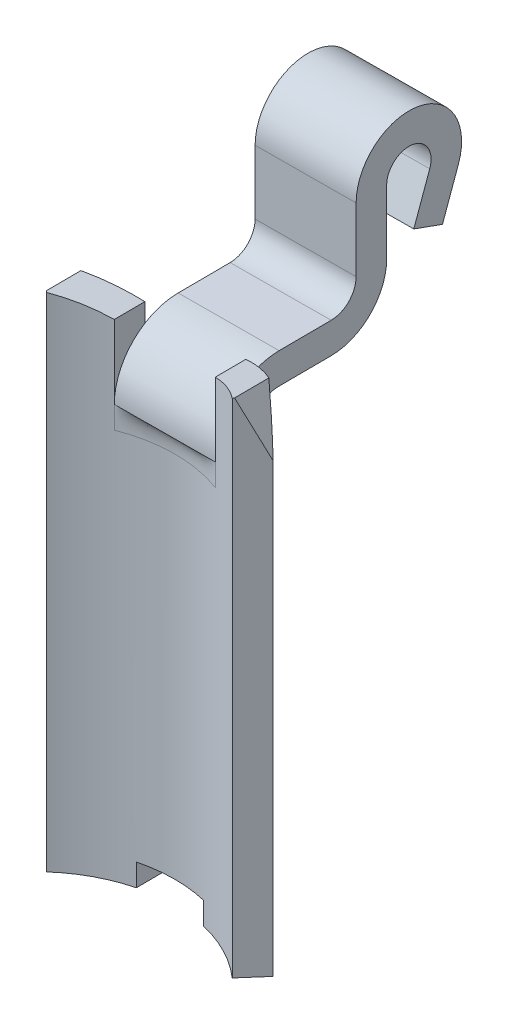
ISO-10303-21;
HEADER;
FILE_DESCRIPTION(('STEP AP214'),'2;1');
FILE_NAME('part.step','',(''),(''),'','','');
FILE_SCHEMA(('AUTOMOTIVE_DESIGN { 1 0 10303 214 1 1 1 1 }'));
ENDSEC;
DATA;
#1=APPLICATION_CONTEXT('core data for automotive mechanical design processes');
#2=APPLICATION_PROTOCOL_DEFINITION('international standard','automotive_design',2000,#1);
#3=PRODUCT_CONTEXT('',#1,'mechanical');
#4=PRODUCT('Part','Part','',(#3));
#5=PRODUCT_RELATED_PRODUCT_CATEGORY('part','',(#4));
#6=PRODUCT_DEFINITION_FORMATION('','',#4);
#7=PRODUCT_DEFINITION_CONTEXT('part definition',#1,'design');
#8=PRODUCT_DEFINITION('design','',#6,#7);
#9=PRODUCT_DEFINITION_SHAPE('','',#8);
#10=(LENGTH_UNIT() NAMED_UNIT(*) SI_UNIT(.MILLI.,.METRE.));
#11=(NAMED_UNIT(*) PLANE_ANGLE_UNIT() SI_UNIT($,.RADIAN.));
#12=(NAMED_UNIT(*) SI_UNIT($,.STERADIAN.) SOLID_ANGLE_UNIT());
#13=UNCERTAINTY_MEASURE_WITH_UNIT(LENGTH_MEASURE(1.E-05),#10,'distance_accuracy_value','');
#14=(GEOMETRIC_REPRESENTATION_CONTEXT(3) GLOBAL_UNCERTAINTY_ASSIGNED_CONTEXT((#13)) GLOBAL_UNIT_ASSIGNED_CONTEXT((#10,
#11,#12)) REPRESENTATION_CONTEXT('',''));
#15=CARTESIAN_POINT('',(0.,0.,0.));
#16=DIRECTION('',(0.,0.,1.));
#17=DIRECTION('',(1.,0.,0.));
#18=AXIS2_PLACEMENT_3D('',#15,#16,#17);
#19=CARTESIAN_POINT('',(-4.36036135623731,0.,0.));
#20=DIRECTION('',(0.,1.,0.));
#21=DIRECTION('',(0.,0.,1.));
#22=AXIS2_PLACEMENT_3D('',#19,#20,#21);
#23=PLANE('',#22);
#24=CARTESIAN_POINT('',(0.,0.,0.));
#25=DIRECTION('',(0.,1.,0.));
#26=DIRECTION('',(0.,0.,1.));
#27=AXIS2_PLACEMENT_3D('',#24,#25,#26);
#28=CIRCLE('',#27,1.9177);
#29=CARTESIAN_POINT('',(-0.391599735436339,0.,-1.87729138313853));
#30=VERTEX_POINT('',#29);
#31=CARTESIAN_POINT('',(-1.27808814790162,0.,-1.42970765410045));
#32=VERTEX_POINT('',#31);
#33=EDGE_CURVE('E409',#30,#32,#28,.T.);
#34=ORIENTED_EDGE('',*,*,#33,.F.);
#35=DIRECTION('',(0.0056429708265948,0.,0.999984078313375));
#36=VECTOR('',#35,1.);
#37=CARTESIAN_POINT('',(-0.381132781346214,0.,-0.0224550282823861));
#38=LINE('',#37,#36);
#39=CARTESIAN_POINT('',(-0.389690327236441,0.,-1.53892745081058));
#40=VERTEX_POINT('',#39);
#41=EDGE_CURVE('E105',#30,#40,#38,.T.);
#42=ORIENTED_EDGE('',*,*,#41,.T.);
#43=CARTESIAN_POINT('',(0.,0.,0.));
#44=DIRECTION('',(0.,1.,0.));
#45=DIRECTION('',(0.,0.,1.));
#46=AXIS2_PLACEMENT_3D('',#43,#44,#45);
#47=CIRCLE('',#46,1.5875);
#48=CARTESIAN_POINT('',(-1.05801998998478,0.,-1.18353282624209));
#49=VERTEX_POINT('',#48);
#50=EDGE_CURVE('E317',#40,#49,#47,.T.);
#51=ORIENTED_EDGE('',*,*,#50,.T.);
#52=DIRECTION('',(-0.666469285029785,0.,-0.745532488971398));
#53=VECTOR('',#52,1.);
#54=CARTESIAN_POINT('',(-1.93679101007827,0.,-2.16655239002732));
#55=LINE('',#54,#53);
#56=EDGE_CURVE('E321',#49,#32,#55,.T.);
#57=ORIENTED_EDGE('',*,*,#56,.T.);
#58=EDGE_LOOP('',(#34,#42,#51,#57));
#59=FACE_BOUND('',#58,.T.);
#60=ADVANCED_FACE('F97',(#59),#23,.F.);
#61=CARTESIAN_POINT('',(0.560628849584921,2.72972769820955,-1.92807599157847));
#62=DIRECTION('',(0.999984078313375,0.,-0.0056429708265948));
#63=DIRECTION('',(-0.0056429708265948,0.,-0.999984078313375));
#64=AXIS2_PLACEMENT_3D('',#61,#62,#63);
#65=PLANE('',#64);
#66=CARTESIAN_POINT('',(0.559011115045461,4.699,-2.21475278508123));
#67=DIRECTION('',(0.999984078313375,0.,-0.0056429708265948));
#68=DIRECTION('',(-0.0056429708265948,0.,-0.999984078313375));
#69=AXIS2_PLACEMENT_3D('',#66,#67,#68);
#70=CIRCLE('',#69,0.730501257776782);
#71=CARTESIAN_POINT('',(0.561161086930393,5.32227448817793,-1.83375885124383));
#72=VERTEX_POINT('',#71);
#73=CARTESIAN_POINT('',(0.563133312331886,4.699,-1.48426315811655));
#74=VERTEX_POINT('',#73);
#75=EDGE_CURVE('E570',#72,#74,#70,.T.);
#76=ORIENTED_EDGE('',*,*,#75,.T.);
#77=DIRECTION('',(0.,-1.,0.));
#78=VECTOR('',#77,1.);
#79=CARTESIAN_POINT('',(0.563133312331886,5.715,-1.48426315811655));
#80=LINE('',#79,#78);
#81=CARTESIAN_POINT('',(0.563133312331886,5.53586258856686,-1.48426315811655));
#82=VERTEX_POINT('',#81);
#83=EDGE_CURVE('E573',#74,#82,#80,.F.);
#84=ORIENTED_EDGE('',*,*,#83,.T.);
#85=DIRECTION('',(0.0056429708265948,0.,0.999984078313375));
#86=VECTOR('',#85,1.);
#87=CARTESIAN_POINT('',(0.560628849584921,5.53586258856686,-1.92807599157847));
#88=LINE('',#87,#86);
#89=CARTESIAN_POINT('',(0.561161086930393,5.53586258856686,-1.83375885124383));
#90=VERTEX_POINT('',#89);
#91=EDGE_CURVE('E684',#90,#82,#88,.T.);
#92=ORIENTED_EDGE('',*,*,#91,.F.);
#93=DIRECTION('',(0.,-1.,0.));
#94=VECTOR('',#93,1.);
#95=CARTESIAN_POINT('',(0.561161086930393,5.715,-1.83375885124383));
#96=LINE('',#95,#94);
#97=EDGE_CURVE('E120',#72,#90,#96,.F.);
#98=ORIENTED_EDGE('',*,*,#97,.F.);
#99=EDGE_LOOP('',(#76,#84,#92,#98));
#100=FACE_BOUND('',#99,.T.);
#101=ADVANCED_FACE('F476',(#100),#65,.F.);
#102=CARTESIAN_POINT('',(-0.582352951927267,2.72972769820955,-1.92162607592367));
#103=DIRECTION('',(-0.999984078313375,0.,0.0056429708265948));
#104=DIRECTION('',(0.0056429708265948,0.,0.999984078313375));
#105=AXIS2_PLACEMENT_3D('',#102,#103,#104);
#106=PLANE('',#105);
#107=CARTESIAN_POINT('',(-0.583970686466727,4.699,-2.20830286942643));
#108=DIRECTION('',(-0.999984078313375,0.,0.0056429708265948));
#109=DIRECTION('',(0.0056429708265948,0.,0.999984078313375));
#110=AXIS2_PLACEMENT_3D('',#107,#108,#109);
#111=CIRCLE('',#110,0.730501257776782);
#112=CARTESIAN_POINT('',(-0.581820714581795,5.32227448817793,-1.82730893558903));
#113=VERTEX_POINT('',#112);
#114=CARTESIAN_POINT('',(-0.579848489180302,4.699,-1.47781324246175));
#115=VERTEX_POINT('',#114);
#116=EDGE_CURVE('E301',#113,#115,#111,.F.);
#117=ORIENTED_EDGE('',*,*,#116,.F.);
#118=DIRECTION('',(0.,-1.,0.));
#119=VECTOR('',#118,1.);
#120=CARTESIAN_POINT('',(-0.581820714581795,5.715,-1.82730893558903));
#121=LINE('',#120,#119);
#122=CARTESIAN_POINT('',(-0.581820714581795,5.53586258856686,-1.82730893558903));
#123=VERTEX_POINT('',#122);
#124=EDGE_CURVE('E437',#123,#113,#121,.T.);
#125=ORIENTED_EDGE('',*,*,#124,.F.);
#126=DIRECTION('',(0.0056429708265948,0.,0.999984078313375));
#127=VECTOR('',#126,1.);
#128=CARTESIAN_POINT('',(-0.582352951927267,5.53586258856686,-1.92162607592367));
#129=LINE('',#128,#127);
#130=CARTESIAN_POINT('',(-0.579848489180302,5.53586258856686,-1.47781324246175));
#131=VERTEX_POINT('',#130);
#132=EDGE_CURVE('E681',#123,#131,#129,.T.);
#133=ORIENTED_EDGE('',*,*,#132,.T.);
#134=DIRECTION('',(0.,-1.,0.));
#135=VECTOR('',#134,1.);
#136=CARTESIAN_POINT('',(-0.579848489180302,5.715,-1.47781324246175));
#137=LINE('',#136,#135);
#138=EDGE_CURVE('E344',#131,#115,#137,.T.);
#139=ORIENTED_EDGE('',*,*,#138,.T.);
#140=EDGE_LOOP('',(#117,#125,#133,#139));
#141=FACE_BOUND('',#140,.T.);
#142=ADVANCED_FACE('F472',(#141),#106,.F.);
#143=CARTESIAN_POINT('',(-1.88795373570001,5.715,2.16050716346106));
#144=DIRECTION('',(-0.753006622516556,0.,-0.658012937901838));
#145=DIRECTION('',(-0.658012937901838,0.,0.753006622516556));
#146=AXIS2_PLACEMENT_3D('',#143,#144,#145);
#147=PLANE('',#146);
#148=DIRECTION('',(0.,-1.,0.));
#149=VECTOR('',#148,1.);
#150=CARTESIAN_POINT('',(1.26187141101436,5.715,-1.4440408));
#151=LINE('',#150,#149);
#152=CARTESIAN_POINT('',(1.26187141101436,5.08,-1.4440408));
#153=VERTEX_POINT('',#152);
#154=CARTESIAN_POINT('',(1.26187141101436,0.,-1.4440408));
#155=VERTEX_POINT('',#154);
#156=EDGE_CURVE('E330',#153,#155,#151,.T.);
#157=ORIENTED_EDGE('',*,*,#156,.F.);
#158=DIRECTION('',(-0.289835200165371,0.897767150159775,0.331677103278316));
#159=VECTOR('',#158,1.);
#160=CARTESIAN_POINT('',(0.485530909869357,7.48472171381836,-0.555624319080876));
#161=LINE('',#160,#159);
#162=CARTESIAN_POINT('',(1.05686797323847,5.715,-1.20944215095817));
#163=VERTEX_POINT('',#162);
#164=EDGE_CURVE('E677',#153,#163,#161,.T.);
#165=ORIENTED_EDGE('',*,*,#164,.T.);
#166=DIRECTION('',(-0.63969216091557,-0.234328718136982,0.732040976393704));
#167=VECTOR('',#166,1.);
#168=CARTESIAN_POINT('',(-1.72625372836969,4.69550127764011,1.97546342135934));
#169=LINE('',#168,#167);
#170=CARTESIAN_POINT('',(1.04459553891917,5.71050442544372,-1.19539801324503));
#171=VERTEX_POINT('',#170);
#172=EDGE_CURVE('E696',#163,#171,#169,.T.);
#173=ORIENTED_EDGE('',*,*,#172,.T.);
#174=DIRECTION('',(0.,-1.,0.));
#175=VECTOR('',#174,1.);
#176=CARTESIAN_POINT('',(1.04459553891917,5.715,-1.19539801324503));
#177=LINE('',#176,#175);
#178=CARTESIAN_POINT('',(1.04459553891917,0.,-1.19539801324503));
#179=VERTEX_POINT('',#178);
#180=EDGE_CURVE('E316',#171,#179,#177,.T.);
#181=ORIENTED_EDGE('',*,*,#180,.T.);
#182=DIRECTION('',(0.658012937901838,0.,-0.753006622516556));
#183=VECTOR('',#182,1.);
#184=CARTESIAN_POINT('',(-1.88795373570001,0.,2.16050716346106));
#185=LINE('',#184,#183);
#186=EDGE_CURVE('E315',#179,#155,#185,.T.);
#187=ORIENTED_EDGE('',*,*,#186,.T.);
#188=EDGE_LOOP('',(#157,#165,#173,#181,#187));
#189=FACE_BOUND('',#188,.T.);
#190=ADVANCED_FACE('F99',(#189),#147,.F.);
#191=CARTESIAN_POINT('',(0.,5.715,0.));
#192=DIRECTION('',(0.,-1.,0.));
#193=DIRECTION('',(0.,0.,-1.));
#194=AXIS2_PLACEMENT_3D('',#191,#192,#193);
#195=CYLINDRICAL_SURFACE('',#194,1.9177);
#196=CARTESIAN_POINT('',(0.,0.254,0.));
#197=DIRECTION('',(0.,1.,0.));
#198=DIRECTION('',(0.,0.,1.));
#199=AXIS2_PLACEMENT_3D('',#196,#197,#198);
#200=CIRCLE('',#199,1.9177);
#201=CARTESIAN_POINT('',(0.370388132238453,0.254,-1.8815913269084));
#202=VERTEX_POINT('',#201);
#203=CARTESIAN_POINT('',(-0.391599735436339,0.254,-1.87729138313853));
#204=VERTEX_POINT('',#203);
#205=EDGE_CURVE('E401',#202,#204,#200,.T.);
#206=ORIENTED_EDGE('',*,*,#205,.T.);
#207=DIRECTION('',(0.,-1.,0.));
#208=VECTOR('',#207,1.);
#209=CARTESIAN_POINT('',(-0.391599735436339,5.715,-1.87729138313853));
#210=LINE('',#209,#208);
#211=EDGE_CURVE('E772',#204,#30,#210,.T.);
#212=ORIENTED_EDGE('',*,*,#211,.T.);
#213=ORIENTED_EDGE('',*,*,#33,.T.);
#214=DIRECTION('',(0.,-1.,0.));
#215=VECTOR('',#214,1.);
#216=CARTESIAN_POINT('',(-1.27808814790162,5.715,-1.42970765410045));
#217=LINE('',#216,#215);
#218=CARTESIAN_POINT('',(-1.27808814790162,5.08,-1.42970765410045));
#219=VERTEX_POINT('',#218);
#220=EDGE_CURVE('E327',#219,#32,#217,.T.);
#221=ORIENTED_EDGE('',*,*,#220,.F.);
#222=CARTESIAN_POINT('',(0.,8.98865809221266,0.));
#223=DIRECTION('',(0.95104137387134,-0.309016994374942,-0.00536678417589645));
#224=DIRECTION('',(-0.309012074303196,-0.951056516295155,0.00174377388417981));
#225=AXIS2_PLACEMENT_3D('',#222,#223,#224);
#226=ELLIPSE('',#225,6.20580756045146,1.9177);
#227=CARTESIAN_POINT('',(-1.07266338357229,5.715,-1.58964353096638));
#228=VERTEX_POINT('',#227);
#229=EDGE_CURVE('E426',#219,#228,#226,.T.);
#230=ORIENTED_EDGE('',*,*,#229,.T.);
#231=CARTESIAN_POINT('',(0.,5.32785359968373,0.));
#232=DIRECTION('',(-0.342014697788126,-0.939692620785909,0.00193000969089451));
#233=DIRECTION('',(0.939677659294477,-0.342020143325667,-0.0053026580450613));
#234=AXIS2_PLACEMENT_3D('',#231,#232,#233);
#235=ELLIPSE('',#234,2.04077371427706,1.9177);
#236=EDGE_CURVE('E691',#228,#123,#235,.T.);
#237=ORIENTED_EDGE('',*,*,#236,.T.);
#238=ORIENTED_EDGE('',*,*,#124,.T.);
#239=CARTESIAN_POINT('',(-0.581820714581795,4.699,-1.82730893558903));
#240=VERTEX_POINT('',#239);
#241=EDGE_CURVE('E702',#113,#240,#121,.T.);
#242=ORIENTED_EDGE('',*,*,#241,.T.);
#243=CARTESIAN_POINT('',(-0.581820714581795,4.445,-1.82730893558903));
#244=VERTEX_POINT('',#243);
#245=EDGE_CURVE('E700',#240,#244,#121,.T.);
#246=ORIENTED_EDGE('',*,*,#245,.T.);
#247=CARTESIAN_POINT('',(0.561161086930393,4.445,-1.83375885124383));
#248=CARTESIAN_POINT('',(0.188377974472141,4.445,-1.94783676090708));
#249=CARTESIAN_POINT('',(-0.210348799411702,4.445,-1.94558672152985));
#250=CARTESIAN_POINT('',(-0.581820714581796,4.445,-1.82730893558903));
#251=B_SPLINE_CURVE_WITH_KNOTS('',3,(#247,#248,#249,#250),.UNSPECIFIED.,.F.,.F.,(4,4),(0.,1.),.UNSPECIFIED.);
#252=CARTESIAN_POINT('',(0.561161086930393,4.445,-1.83375885124383));
#253=VERTEX_POINT('',#252);
#254=EDGE_CURVE('E436',#244,#253,#251,.F.);
#255=ORIENTED_EDGE('',*,*,#254,.T.);
#256=CARTESIAN_POINT('',(0.561161086930393,4.699,-1.83375885124383));
#257=VERTEX_POINT('',#256);
#258=EDGE_CURVE('E432',#253,#257,#96,.F.);
#259=ORIENTED_EDGE('',*,*,#258,.T.);
#260=EDGE_CURVE('E435',#257,#72,#96,.F.);
#261=ORIENTED_EDGE('',*,*,#260,.T.);
#262=ORIENTED_EDGE('',*,*,#97,.T.);
#263=CARTESIAN_POINT('',(0.,5.32785359968373,0.));
#264=DIRECTION('',(0.342014697788125,-0.939692620785909,-0.00193000969089451));
#265=DIRECTION('',(-0.939677659294477,-0.342020143325667,0.0053026580450613));
#266=AXIS2_PLACEMENT_3D('',#263,#264,#265);
#267=ELLIPSE('',#266,2.04077371427706,1.9177);
#268=CARTESIAN_POINT('',(1.05465473118028,5.715,-1.60164811616006));
#269=VERTEX_POINT('',#268);
#270=EDGE_CURVE('E698',#90,#269,#267,.T.);
#271=ORIENTED_EDGE('',*,*,#270,.T.);
#272=CARTESIAN_POINT('',(0.,8.98865809221266,0.));
#273=DIRECTION('',(-0.95104137387134,-0.309016994374941,0.00536678417589645));
#274=DIRECTION('',(0.309012074303195,-0.951056516295156,-0.0017437738841798));
#275=AXIS2_PLACEMENT_3D('',#272,#273,#274);
#276=ELLIPSE('',#275,6.20580756045147,1.9177);
#277=EDGE_CURVE('E674',#269,#153,#276,.T.);
#278=ORIENTED_EDGE('',*,*,#277,.T.);
#279=ORIENTED_EDGE('',*,*,#156,.T.);
#280=CARTESIAN_POINT('',(0.370388132238452,0.,-1.8815913269084));
#281=VERTEX_POINT('',#280);
#282=EDGE_CURVE('E422',#155,#281,#28,.T.);
#283=ORIENTED_EDGE('',*,*,#282,.T.);
#284=DIRECTION('',(0.,-1.,0.));
#285=VECTOR('',#284,1.);
#286=CARTESIAN_POINT('',(0.370388132238454,5.715,-1.8815913269084));
#287=LINE('',#286,#285);
#288=EDGE_CURVE('E112',#281,#202,#287,.F.);
#289=ORIENTED_EDGE('',*,*,#288,.T.);
#290=EDGE_LOOP('',(#206,#212,#213,#221,#230,#237,#238,#242,#246,#255,#259,#261,#262,#271,#278,
#279,#283,#289));
#291=FACE_BOUND('',#290,.T.);
#292=ADVANCED_FACE('F460',(#291),#195,.T.);
#293=CARTESIAN_POINT('',(-1.93679101007827,5.715,-2.16655239002732));
#294=DIRECTION('',(-0.745532488971398,0.,0.666469285029785));
#295=DIRECTION('',(0.666469285029785,0.,0.745532488971398));
#296=AXIS2_PLACEMENT_3D('',#293,#294,#295);
#297=PLANE('',#296);
#298=DIRECTION('',(0.647913061533386,-0.234328718136982,0.724774941999731));
#299=VECTOR('',#298,1.);
#300=CARTESIAN_POINT('',(-1.88922027791062,6.01112206930444,-2.11333834528173));
#301=LINE('',#300,#299);
#302=CARTESIAN_POINT('',(-1.07045014151409,5.715,-1.19743756576437));
#303=VERTEX_POINT('',#302);
#304=CARTESIAN_POINT('',(-1.05801998998478,5.71050442544372,-1.18353282624209));
#305=VERTEX_POINT('',#304);
#306=EDGE_CURVE('E689',#303,#305,#301,.T.);
#307=ORIENTED_EDGE('',*,*,#306,.F.);
#308=DIRECTION('',(0.293559970487231,0.897767150159775,0.328384968933616));
#309=VECTOR('',#308,1.);
#310=CARTESIAN_POINT('',(-1.23853252362222,5.20096928618425,-1.38545954892255));
#311=LINE('',#310,#309);
#312=EDGE_CURVE('E429',#219,#303,#311,.T.);
#313=ORIENTED_EDGE('',*,*,#312,.F.);
#314=ORIENTED_EDGE('',*,*,#220,.T.);
#315=ORIENTED_EDGE('',*,*,#56,.F.);
#316=DIRECTION('',(0.,-1.,0.));
#317=VECTOR('',#316,1.);
#318=CARTESIAN_POINT('',(-1.05801998998478,5.715,-1.18353282624209));
#319=LINE('',#318,#317);
#320=EDGE_CURVE('E319',#305,#49,#319,.T.);
#321=ORIENTED_EDGE('',*,*,#320,.F.);
#322=EDGE_LOOP('',(#307,#313,#314,#315,#321));
#323=FACE_BOUND('',#322,.T.);
#324=ADVANCED_FACE('F371',(#323),#297,.T.);
#325=CARTESIAN_POINT('',(0.,5.715,0.));
#326=DIRECTION('',(0.,-1.,0.));
#327=DIRECTION('',(0.,0.,-1.));
#328=AXIS2_PLACEMENT_3D('',#325,#326,#327);
#329=CYLINDRICAL_SURFACE('',#328,1.5875);
#330=DIRECTION('',(0.,-1.,0.));
#331=VECTOR('',#330,1.);
#332=CARTESIAN_POINT('',(-0.389690327236441,5.715,-1.53892745081058));
#333=LINE('',#332,#331);
#334=CARTESIAN_POINT('',(-0.389690327236441,0.254,-1.53892745081058));
#335=VERTEX_POINT('',#334);
#336=EDGE_CURVE('E412',#335,#40,#333,.T.);
#337=ORIENTED_EDGE('',*,*,#336,.F.);
#338=CARTESIAN_POINT('',(0.,0.254,0.));
#339=DIRECTION('',(0.,1.,0.));
#340=DIRECTION('',(0.,0.,1.));
#341=AXIS2_PLACEMENT_3D('',#338,#339,#340);
#342=CIRCLE('',#341,1.5875);
#343=CARTESIAN_POINT('',(0.372297540438351,0.254,-1.54322739458045));
#344=VERTEX_POINT('',#343);
#345=EDGE_CURVE('E12',#344,#335,#342,.T.);
#346=ORIENTED_EDGE('',*,*,#345,.F.);
#347=DIRECTION('',(0.,-1.,0.));
#348=VECTOR('',#347,1.);
#349=CARTESIAN_POINT('',(0.372297540438352,5.715,-1.54322739458045));
#350=LINE('',#349,#348);
#351=CARTESIAN_POINT('',(0.372297540438351,0.,-1.54322739458045));
#352=VERTEX_POINT('',#351);
#353=EDGE_CURVE('E295',#352,#344,#350,.F.);
#354=ORIENTED_EDGE('',*,*,#353,.F.);
#355=EDGE_CURVE('E309',#179,#352,#47,.T.);
#356=ORIENTED_EDGE('',*,*,#355,.F.);
#357=ORIENTED_EDGE('',*,*,#180,.F.);
#358=CARTESIAN_POINT('',(0.,5.32785359968373,0.));
#359=DIRECTION('',(0.342014697788125,-0.939692620785909,-0.00193000969089451));
#360=DIRECTION('',(-0.939677659294477,-0.342020143325667,0.0053026580450613));
#361=AXIS2_PLACEMENT_3D('',#358,#359,#360);
#362=ELLIPSE('',#361,1.68938221380551,1.5875);
#363=EDGE_CURVE('E694',#82,#171,#362,.T.);
#364=ORIENTED_EDGE('',*,*,#363,.F.);
#365=ORIENTED_EDGE('',*,*,#83,.F.);
#366=CARTESIAN_POINT('',(0.563133312331886,4.445,-1.48426315811655));
#367=VERTEX_POINT('',#366);
#368=EDGE_CURVE('E350',#367,#74,#80,.F.);
#369=ORIENTED_EDGE('',*,*,#368,.F.);
#370=CARTESIAN_POINT('',(0.,4.445,0.));
#371=DIRECTION('',(0.,-1.,0.));
#372=DIRECTION('',(0.,0.,-1.));
#373=AXIS2_PLACEMENT_3D('',#370,#371,#372);
#374=CIRCLE('',#373,1.5875);
#375=CARTESIAN_POINT('',(0.363904641624312,4.445,-1.54523092651541));
#376=VERTEX_POINT('',#375);
#377=EDGE_CURVE('E388',#376,#367,#374,.T.);
#378=ORIENTED_EDGE('',*,*,#377,.F.);
#379=CARTESIAN_POINT('',(-0.00895820457661473,4.445,-1.58747278753677));
#380=VERTEX_POINT('',#379);
#381=EDGE_CURVE('E379',#380,#376,#374,.T.);
#382=ORIENTED_EDGE('',*,*,#381,.F.);
#383=CARTESIAN_POINT('',(-0.579848489180303,4.445,-1.47781324246175));
#384=CARTESIAN_POINT('',(-0.212884162331215,4.445,-1.6217987640369));
#385=CARTESIAN_POINT('',(0.194567369738339,4.445,-1.62409803775393));
#386=CARTESIAN_POINT('',(0.563133312331885,4.445,-1.48426315811655));
#387=B_SPLINE_CURVE_WITH_KNOTS('',3,(#383,#384,#385,#386),.UNSPECIFIED.,.F.,.F.,(4,4),(0.,1.),.UNSPECIFIED.);
#388=CARTESIAN_POINT('',(-0.579848489180302,4.445,-1.47781324246175));
#389=VERTEX_POINT('',#388);
#390=EDGE_CURVE('E347',#389,#380,#387,.T.);
#391=ORIENTED_EDGE('',*,*,#390,.F.);
#392=EDGE_CURVE('E335',#115,#389,#137,.T.);
#393=ORIENTED_EDGE('',*,*,#392,.F.);
#394=ORIENTED_EDGE('',*,*,#138,.F.);
#395=CARTESIAN_POINT('',(0.,5.32785359968373,0.));
#396=DIRECTION('',(-0.342014697788126,-0.939692620785909,0.00193000969089451));
#397=DIRECTION('',(0.939677659294477,-0.342020143325667,-0.0053026580450613));
#398=AXIS2_PLACEMENT_3D('',#395,#396,#397);
#399=ELLIPSE('',#398,1.68938221380551,1.5875);
#400=EDGE_CURVE('E417',#305,#131,#399,.T.);
#401=ORIENTED_EDGE('',*,*,#400,.F.);
#402=ORIENTED_EDGE('',*,*,#320,.T.);
#403=ORIENTED_EDGE('',*,*,#50,.F.);
#404=EDGE_LOOP('',(#337,#346,#354,#356,#357,#364,#365,#369,#378,#382,#391,#393,#394,#401,#402,#403));
#405=FACE_BOUND('',#404,.T.);
#406=ADVANCED_FACE('F307',(#405),#329,.F.);
#407=ORIENTED_EDGE('',*,*,#355,.T.);
#408=DIRECTION('',(-0.0056429708265948,0.,-0.999984078313375));
#409=VECTOR('',#408,1.);
#410=CARTESIAN_POINT('',(0.380855086328576,0.,-0.0267549720522514));
#411=LINE('',#410,#409);
#412=EDGE_CURVE('E292',#352,#281,#411,.T.);
#413=ORIENTED_EDGE('',*,*,#412,.T.);
#414=ORIENTED_EDGE('',*,*,#282,.F.);
#415=ORIENTED_EDGE('',*,*,#186,.F.);
#416=EDGE_LOOP('',(#407,#413,#414,#415));
#417=FACE_BOUND('',#416,.T.);
#418=ADVANCED_FACE('F313',(#417),#23,.F.);
#419=CARTESIAN_POINT('',(-1.85028804097525,3.32739686871312,-1.91447104128594));
#420=DIRECTION('',(0.95104137387134,-0.309016994374942,-0.00536678417589645));
#421=DIRECTION('',(0.30902144468235,0.951055070291113,0.));
#422=AXIS2_PLACEMENT_3D('',#419,#420,#421);
#423=PLANE('',#422);
#424=ORIENTED_EDGE('',*,*,#312,.T.);
#425=DIRECTION('',(-0.0056429708265948,0.,-0.999984078313375));
#426=VECTOR('',#425,1.);
#427=CARTESIAN_POINT('',(-1.0637979048851,5.715,-0.0186027075704793));
#428=LINE('',#427,#426);
#429=EDGE_CURVE('E332',#303,#228,#428,.T.);
#430=ORIENTED_EDGE('',*,*,#429,.T.);
#431=ORIENTED_EDGE('',*,*,#229,.F.);
#432=EDGE_LOOP('',(#424,#430,#431));
#433=FACE_BOUND('',#432,.T.);
#434=ADVANCED_FACE('F482',(#433),#423,.F.);
#435=CARTESIAN_POINT('',(-0.845886846502342,5.02392459024651,-1.92013893816702));
#436=DIRECTION('',(0.342014697788125,-0.939692620785909,-0.00193000969089451));
#437=DIRECTION('',(0.939694370938896,0.342015334781576,0.));
#438=AXIS2_PLACEMENT_3D('',#435,#436,#437);
#439=PLANE('',#438);
#440=ORIENTED_EDGE('',*,*,#91,.T.);
#441=ORIENTED_EDGE('',*,*,#363,.T.);
#442=ORIENTED_EDGE('',*,*,#172,.F.);
#443=DIRECTION('',(0.0056429708265948,0.,0.999984078313375));
#444=VECTOR('',#443,1.);
#445=CARTESIAN_POINT('',(1.05279700620511,5.715,-1.93085332634791));
#446=LINE('',#445,#444);
#447=EDGE_CURVE('E680',#269,#163,#446,.T.);
#448=ORIENTED_EDGE('',*,*,#447,.F.);
#449=ORIENTED_EDGE('',*,*,#270,.F.);
#450=EDGE_LOOP('',(#440,#441,#442,#448,#449));
#451=FACE_BOUND('',#450,.T.);
#452=ADVANCED_FACE('F486',(#451),#439,.F.);
#453=CARTESIAN_POINT('',(0.82412970146743,5.02393661699455,-1.9295629428732));
#454=DIRECTION('',(-0.342014697788126,-0.939692620785909,0.00193000969089451));
#455=DIRECTION('',(0.939694370938896,-0.342015334781576,0.));
#456=AXIS2_PLACEMENT_3D('',#453,#454,#455);
#457=PLANE('',#456);
#458=ORIENTED_EDGE('',*,*,#429,.F.);
#459=ORIENTED_EDGE('',*,*,#306,.T.);
#460=ORIENTED_EDGE('',*,*,#400,.T.);
#461=ORIENTED_EDGE('',*,*,#132,.F.);
#462=ORIENTED_EDGE('',*,*,#236,.F.);
#463=EDGE_LOOP('',(#458,#459,#460,#461,#462));
#464=FACE_BOUND('',#463,.T.);
#465=ADVANCED_FACE('F491',(#464),#457,.F.);
#466=CARTESIAN_POINT('',(1.82856036534076,3.32740786635064,-1.9352310060519));
#467=DIRECTION('',(-0.95104137387134,-0.309016994374941,0.00536678417589645));
#468=DIRECTION('',(0.30902144468235,-0.951055070291113,0.));
#469=AXIS2_PLACEMENT_3D('',#466,#467,#468);
#470=PLANE('',#469);
#471=ORIENTED_EDGE('',*,*,#277,.F.);
#472=ORIENTED_EDGE('',*,*,#447,.T.);
#473=ORIENTED_EDGE('',*,*,#164,.F.);
#474=EDGE_LOOP('',(#471,#472,#473));
#475=FACE_BOUND('',#474,.T.);
#476=ADVANCED_FACE('F500',(#475),#470,.F.);
#477=CARTESIAN_POINT('',(0.559011115045461,5.08,-2.21475278508123));
#478=DIRECTION('',(-0.999984078313375,0.,0.0056429708265948));
#479=DIRECTION('',(0.0056429708265948,0.,0.999984078313375));
#480=AXIS2_PLACEMENT_3D('',#477,#478,#479);
#481=PLANE('',#480);
#482=CARTESIAN_POINT('',(0.559011115045461,5.42950125777678,-2.21475278508123));
#483=VERTEX_POINT('',#482);
#484=EDGE_CURVE('E449',#483,#72,#70,.T.);
#485=ORIENTED_EDGE('',*,*,#484,.T.);
#486=ORIENTED_EDGE('',*,*,#260,.F.);
#487=CARTESIAN_POINT('',(0.559011115045461,4.699,-2.21475278508123));
#488=DIRECTION('',(0.999984078313375,0.,-0.0056429708265948));
#489=DIRECTION('',(-0.0056429708265948,0.,-0.999984078313375));
#490=AXIS2_PLACEMENT_3D('',#487,#488,#489);
#491=CIRCLE('',#490,0.381);
#492=CARTESIAN_POINT('',(0.559011115045461,5.08,-2.21475278508123));
#493=VERTEX_POINT('',#492);
#494=EDGE_CURVE('E445',#493,#257,#491,.T.);
#495=ORIENTED_EDGE('',*,*,#494,.F.);
#496=DIRECTION('',(-0.0056429708265948,0.,-0.999984078313375));
#497=VECTOR('',#496,1.);
#498=CARTESIAN_POINT('',(0.559011115045461,5.08,-2.21475278508123));
#499=LINE('',#498,#497);
#500=CARTESIAN_POINT('',(0.55565277453709,5.08,-2.80988027042955));
#501=VERTEX_POINT('',#500);
#502=EDGE_CURVE('E584',#493,#501,#499,.T.);
#503=ORIENTED_EDGE('',*,*,#502,.T.);
#504=CARTESIAN_POINT('',(0.55565277453709,5.715,-2.80988027042955));
#505=DIRECTION('',(0.999984078313375,0.,-0.0056429708265948));
#506=DIRECTION('',(-0.0056429708265948,0.,-0.999984078313375));
#507=AXIS2_PLACEMENT_3D('',#504,#505,#506);
#508=CIRCLE('',#507,0.635000000000002);
#509=CARTESIAN_POINT('',(0.552069488062202,5.715,-3.44487016015854));
#510=VERTEX_POINT('',#509);
#511=EDGE_CURVE('E602',#501,#510,#508,.T.);
#512=ORIENTED_EDGE('',*,*,#511,.T.);
#513=DIRECTION('',(0.,1.,0.));
#514=VECTOR('',#513,1.);
#515=CARTESIAN_POINT('',(0.552069488062202,5.715,-3.44487016015854));
#516=LINE('',#515,#514);
#517=CARTESIAN_POINT('',(0.552069488062202,6.4418649394985,-3.44487016015854));
#518=VERTEX_POINT('',#517);
#519=EDGE_CURVE('E620',#510,#518,#516,.T.);
#520=ORIENTED_EDGE('',*,*,#519,.T.);
#521=CARTESIAN_POINT('',(0.550636173472248,6.4418649394985,-3.69886611605014));
#522=DIRECTION('',(-0.999984078313375,0.,0.0056429708265948));
#523=DIRECTION('',(0.0056429708265948,0.,0.999984078313375));
#524=AXIS2_PLACEMENT_3D('',#521,#522,#523);
#525=CIRCLE('',#524,0.253999999999998);
#526=CARTESIAN_POINT('',(0.549289298328802,6.35499182309378,-3.93754424151093));
#527=VERTEX_POINT('',#526);
#528=EDGE_CURVE('E638',#518,#527,#525,.T.);
#529=ORIENTED_EDGE('',*,*,#528,.T.);
#530=DIRECTION('',(0.00193000969089449,-0.93969262078591,0.342014697788122));
#531=VECTOR('',#530,1.);
#532=CARTESIAN_POINT('',(0.549289298328802,6.35499182309378,-3.93754424151093));
#533=LINE('',#532,#531);
#534=CARTESIAN_POINT('',(0.55031872874463,5.85377767379214,-3.75512011471811));
#535=VERTEX_POINT('',#534);
#536=EDGE_CURVE('E662',#527,#535,#533,.T.);
#537=ORIENTED_EDGE('',*,*,#536,.T.);
#538=DIRECTION('',(0.00530265804506135,0.342020143325681,0.939677659294472));
#539=VECTOR('',#538,1.);
#540=CARTESIAN_POINT('',(0.55031872874463,5.85377767379214,-3.75512011471811));
#541=LINE('',#540,#539);
#542=CARTESIAN_POINT('',(0.54846544308832,5.73424120351481,-4.08353863854627));
#543=VERTEX_POINT('',#542);
#544=EDGE_CURVE('E653',#543,#535,#541,.T.);
#545=ORIENTED_EDGE('',*,*,#544,.F.);
#546=DIRECTION('',(0.00193000969089449,-0.93969262078591,0.342014697788122));
#547=VECTOR('',#546,1.);
#548=CARTESIAN_POINT('',(0.547436012672493,6.23545535281646,-4.26596276533909));
#549=LINE('',#548,#547);
#550=CARTESIAN_POINT('',(0.547436012672493,6.23545535281646,-4.26596276533909));
#551=VERTEX_POINT('',#550);
#552=EDGE_CURVE('E665',#551,#543,#549,.T.);
#553=ORIENTED_EDGE('',*,*,#552,.F.);
#554=CARTESIAN_POINT('',(0.550636173472247,6.4418649394985,-3.69886611605014));
#555=DIRECTION('',(-0.999984078313375,0.,0.0056429708265948));
#556=DIRECTION('',(0.0056429708265948,0.,0.999984078313375));
#557=AXIS2_PLACEMENT_3D('',#554,#555,#556);
#558=CIRCLE('',#557,0.60350125777678);
#559=CARTESIAN_POINT('',(0.554041713463695,6.4418649394985,-3.09537446703126));
#560=VERTEX_POINT('',#559);
#561=EDGE_CURVE('E641',#560,#551,#558,.T.);
#562=ORIENTED_EDGE('',*,*,#561,.F.);
#563=DIRECTION('',(0.,1.,0.));
#564=VECTOR('',#563,1.);
#565=CARTESIAN_POINT('',(0.554041713463695,5.715,-3.09537446703126));
#566=LINE('',#565,#564);
#567=CARTESIAN_POINT('',(0.554041713463695,5.715,-3.09537446703126));
#568=VERTEX_POINT('',#567);
#569=EDGE_CURVE('E623',#568,#560,#566,.T.);
#570=ORIENTED_EDGE('',*,*,#569,.F.);
#571=CARTESIAN_POINT('',(0.55565277453709,5.715,-2.80988027042955));
#572=DIRECTION('',(0.999984078313375,0.,-0.0056429708265948));
#573=DIRECTION('',(-0.0056429708265948,0.,-0.999984078313375));
#574=AXIS2_PLACEMENT_3D('',#571,#572,#573);
#575=CIRCLE('',#574,0.28549874222322);
#576=CARTESIAN_POINT('',(0.55565277453709,5.42950125777678,-2.80988027042955));
#577=VERTEX_POINT('',#576);
#578=EDGE_CURVE('E605',#577,#568,#575,.T.);
#579=ORIENTED_EDGE('',*,*,#578,.F.);
#580=DIRECTION('',(-0.0056429708265948,0.,-0.999984078313375));
#581=VECTOR('',#580,1.);
#582=CARTESIAN_POINT('',(0.559011115045461,5.42950125777678,-2.21475278508123));
#583=LINE('',#582,#581);
#584=EDGE_CURVE('E587',#483,#577,#583,.T.);
#585=ORIENTED_EDGE('',*,*,#584,.F.);
#586=EDGE_LOOP('',(#485,#486,#495,#503,#512,#520,#529,#537,#545,#553,#562,#570,#579,#585));
#587=FACE_BOUND('',#586,.T.);
#588=ADVANCED_FACE('F504',(#587),#481,.F.);
#589=CARTESIAN_POINT('',(-0.583970686466727,5.08,-2.20830286942643));
#590=DIRECTION('',(0.999984078313375,0.,-0.0056429708265948));
#591=DIRECTION('',(-0.0056429708265948,0.,-0.999984078313375));
#592=AXIS2_PLACEMENT_3D('',#589,#590,#591);
#593=PLANE('',#592);
#594=CARTESIAN_POINT('',(-0.583970686466728,4.699,-2.20830286942643));
#595=DIRECTION('',(0.999984078313375,0.,-0.0056429708265948));
#596=DIRECTION('',(-0.0056429708265948,0.,-0.999984078313375));
#597=AXIS2_PLACEMENT_3D('',#594,#595,#596);
#598=CIRCLE('',#597,0.381);
#599=CARTESIAN_POINT('',(-0.583970686466727,5.08,-2.20830286942643));
#600=VERTEX_POINT('',#599);
#601=EDGE_CURVE('E706',#600,#240,#598,.T.);
#602=ORIENTED_EDGE('',*,*,#601,.T.);
#603=ORIENTED_EDGE('',*,*,#241,.F.);
#604=CARTESIAN_POINT('',(-0.583970686466728,4.699,-2.20830286942643));
#605=DIRECTION('',(0.999984078313375,0.,-0.0056429708265948));
#606=DIRECTION('',(-0.0056429708265948,0.,-0.999984078313375));
#607=AXIS2_PLACEMENT_3D('',#604,#605,#606);
#608=CIRCLE('',#607,0.730501257776782);
#609=CARTESIAN_POINT('',(-0.583970686466727,5.42950125777678,-2.20830286942643));
#610=VERTEX_POINT('',#609);
#611=EDGE_CURVE('E572',#610,#113,#608,.T.);
#612=ORIENTED_EDGE('',*,*,#611,.F.);
#613=DIRECTION('',(-0.0056429708265948,0.,-0.999984078313375));
#614=VECTOR('',#613,1.);
#615=CARTESIAN_POINT('',(-0.583970686466727,5.42950125777678,-2.20830286942643));
#616=LINE('',#615,#614);
#617=CARTESIAN_POINT('',(-0.587329026975098,5.42950125777678,-2.80343035477475));
#618=VERTEX_POINT('',#617);
#619=EDGE_CURVE('E590',#610,#618,#616,.T.);
#620=ORIENTED_EDGE('',*,*,#619,.T.);
#621=CARTESIAN_POINT('',(-0.587329026975098,5.715,-2.80343035477475));
#622=DIRECTION('',(0.999984078313375,0.,-0.0056429708265948));
#623=DIRECTION('',(-0.0056429708265948,0.,-0.999984078313375));
#624=AXIS2_PLACEMENT_3D('',#621,#622,#623);
#625=CIRCLE('',#624,0.28549874222322);
#626=CARTESIAN_POINT('',(-0.588940088048493,5.715,-3.08892455137646));
#627=VERTEX_POINT('',#626);
#628=EDGE_CURVE('E608',#618,#627,#625,.T.);
#629=ORIENTED_EDGE('',*,*,#628,.T.);
#630=DIRECTION('',(0.,1.,0.));
#631=VECTOR('',#630,1.);
#632=CARTESIAN_POINT('',(-0.588940088048493,5.715,-3.08892455137646));
#633=LINE('',#632,#631);
#634=CARTESIAN_POINT('',(-0.588940088048493,6.4418649394985,-3.08892455137646));
#635=VERTEX_POINT('',#634);
#636=EDGE_CURVE('E626',#627,#635,#633,.T.);
#637=ORIENTED_EDGE('',*,*,#636,.T.);
#638=CARTESIAN_POINT('',(-0.592345628039941,6.4418649394985,-3.69241620039534));
#639=DIRECTION('',(-0.999984078313375,0.,0.0056429708265948));
#640=DIRECTION('',(0.0056429708265948,0.,0.999984078313375));
#641=AXIS2_PLACEMENT_3D('',#638,#639,#640);
#642=CIRCLE('',#641,0.603501257776781);
#643=CARTESIAN_POINT('',(-0.595545788839696,6.23545535281646,-4.2595128496843));
#644=VERTEX_POINT('',#643);
#645=EDGE_CURVE('E644',#635,#644,#642,.T.);
#646=ORIENTED_EDGE('',*,*,#645,.T.);
#647=DIRECTION('',(0.00193000969089449,-0.93969262078591,0.342014697788122));
#648=VECTOR('',#647,1.);
#649=CARTESIAN_POINT('',(-0.595545788839696,6.23545535281646,-4.2595128496843));
#650=LINE('',#649,#648);
#651=CARTESIAN_POINT('',(-0.594516358423868,5.73424120351482,-4.07708872289147));
#652=VERTEX_POINT('',#651);
#653=EDGE_CURVE('E668',#644,#652,#650,.T.);
#654=ORIENTED_EDGE('',*,*,#653,.T.);
#655=DIRECTION('',(-0.00530265804506135,-0.342020143325681,-0.939677659294472));
#656=VECTOR('',#655,1.);
#657=CARTESIAN_POINT('',(-0.592663072767559,5.85377767379213,-3.74867019906331));
#658=LINE('',#657,#656);
#659=CARTESIAN_POINT('',(-0.592663072767559,5.85377767379213,-3.74867019906331));
#660=VERTEX_POINT('',#659);
#661=EDGE_CURVE('E659',#660,#652,#658,.T.);
#662=ORIENTED_EDGE('',*,*,#661,.F.);
#663=DIRECTION('',(0.00193000969089449,-0.93969262078591,0.342014697788122));
#664=VECTOR('',#663,1.);
#665=CARTESIAN_POINT('',(-0.593692503183387,6.35499182309378,-3.93109432585614));
#666=LINE('',#665,#664);
#667=CARTESIAN_POINT('',(-0.593692503183387,6.35499182309378,-3.93109432585614));
#668=VERTEX_POINT('',#667);
#669=EDGE_CURVE('E671',#668,#660,#666,.T.);
#670=ORIENTED_EDGE('',*,*,#669,.F.);
#671=CARTESIAN_POINT('',(-0.592345628039941,6.4418649394985,-3.69241620039534));
#672=DIRECTION('',(-0.999984078313375,0.,0.0056429708265948));
#673=DIRECTION('',(0.0056429708265948,0.,0.999984078313375));
#674=AXIS2_PLACEMENT_3D('',#671,#672,#673);
#675=CIRCLE('',#674,0.254);
#676=CARTESIAN_POINT('',(-0.590912313449986,6.4418649394985,-3.43842024450374));
#677=VERTEX_POINT('',#676);
#678=EDGE_CURVE('E647',#677,#668,#675,.T.);
#679=ORIENTED_EDGE('',*,*,#678,.F.);
#680=DIRECTION('',(0.,1.,0.));
#681=VECTOR('',#680,1.);
#682=CARTESIAN_POINT('',(-0.590912313449986,5.715,-3.43842024450374));
#683=LINE('',#682,#681);
#684=CARTESIAN_POINT('',(-0.590912313449986,5.715,-3.43842024450374));
#685=VERTEX_POINT('',#684);
#686=EDGE_CURVE('E629',#685,#677,#683,.T.);
#687=ORIENTED_EDGE('',*,*,#686,.F.);
#688=CARTESIAN_POINT('',(-0.587329026975098,5.715,-2.80343035477475));
#689=DIRECTION('',(0.999984078313375,0.,-0.0056429708265948));
#690=DIRECTION('',(-0.0056429708265948,0.,-0.999984078313375));
#691=AXIS2_PLACEMENT_3D('',#688,#689,#690);
#692=CIRCLE('',#691,0.635000000000002);
#693=CARTESIAN_POINT('',(-0.587329026975098,5.08,-2.80343035477475));
#694=VERTEX_POINT('',#693);
#695=EDGE_CURVE('E611',#694,#685,#692,.T.);
#696=ORIENTED_EDGE('',*,*,#695,.F.);
#697=DIRECTION('',(-0.0056429708265948,0.,-0.999984078313375));
#698=VECTOR('',#697,1.);
#699=CARTESIAN_POINT('',(-0.583970686466727,5.08,-2.20830286942643));
#700=LINE('',#699,#698);
#701=EDGE_CURVE('E593',#600,#694,#700,.T.);
#702=ORIENTED_EDGE('',*,*,#701,.F.);
#703=EDGE_LOOP('',(#602,#603,#612,#620,#629,#637,#646,#654,#662,#670,#679,#687,#696,#702));
#704=FACE_BOUND('',#703,.T.);
#705=ADVANCED_FACE('F510',(#704),#593,.F.);
#706=CARTESIAN_POINT('',(0.547436012672493,6.23545535281646,-4.26596276533909));
#707=DIRECTION('',(-0.00530265804506115,-0.342020143325664,-0.939677659294478));
#708=DIRECTION('',(0.,0.939690870586971,-0.342024951919448));
#709=AXIS2_PLACEMENT_3D('',#706,#707,#708);
#710=PLANE('',#709);
#711=DIRECTION('',(0.999984078313376,0.,-0.00564297082659466));
#712=VECTOR('',#711,1.);
#713=CARTESIAN_POINT('',(0.547436012672493,6.23545535281646,-4.26596276533909));
#714=LINE('',#713,#712);
#715=EDGE_CURVE('E635',#644,#551,#714,.T.);
#716=ORIENTED_EDGE('',*,*,#715,.T.);
#717=ORIENTED_EDGE('',*,*,#552,.T.);
#718=DIRECTION('',(0.999984078313376,0.,-0.00564297082659466));
#719=VECTOR('',#718,1.);
#720=CARTESIAN_POINT('',(0.54846544308832,5.73424120351481,-4.08353863854627));
#721=LINE('',#720,#719);
#722=EDGE_CURVE('E656',#652,#543,#721,.T.);
#723=ORIENTED_EDGE('',*,*,#722,.F.);
#724=ORIENTED_EDGE('',*,*,#653,.F.);
#725=EDGE_LOOP('',(#716,#717,#723,#724));
#726=FACE_BOUND('',#725,.T.);
#727=ADVANCED_FACE('F506',(#726),#710,.T.);
#728=CARTESIAN_POINT('',(0.549289298328802,6.35499182309378,-3.93754424151093));
#729=DIRECTION('',(0.00530265804506115,0.342020143325664,0.939677659294478));
#730=DIRECTION('',(0.,-0.939690870586971,0.342024951919448));
#731=AXIS2_PLACEMENT_3D('',#728,#729,#730);
#732=PLANE('',#731);
#733=DIRECTION('',(-0.999984078313376,0.,0.00564297082659466));
#734=VECTOR('',#733,1.);
#735=CARTESIAN_POINT('',(0.549289298328802,6.35499182309378,-3.93754424151093));
#736=LINE('',#735,#734);
#737=EDGE_CURVE('E632',#527,#668,#736,.T.);
#738=ORIENTED_EDGE('',*,*,#737,.T.);
#739=ORIENTED_EDGE('',*,*,#669,.T.);
#740=DIRECTION('',(-0.999984078313376,0.,0.00564297082659466));
#741=VECTOR('',#740,1.);
#742=CARTESIAN_POINT('',(0.55031872874463,5.85377767379214,-3.75512011471811));
#743=LINE('',#742,#741);
#744=EDGE_CURVE('E650',#535,#660,#743,.T.);
#745=ORIENTED_EDGE('',*,*,#744,.F.);
#746=ORIENTED_EDGE('',*,*,#536,.F.);
#747=EDGE_LOOP('',(#738,#739,#745,#746));
#748=FACE_BOUND('',#747,.T.);
#749=ADVANCED_FACE('F509',(#748),#732,.T.);
#750=CARTESIAN_POINT('',(-0.0208547272838464,6.4418649394985,-3.69564115822274));
#751=DIRECTION('',(-0.999984078313375,0.,0.0056429708265948));
#752=DIRECTION('',(0.0056429708265948,0.,0.999984078313375));
#753=AXIS2_PLACEMENT_3D('',#750,#751,#752);
#754=CYLINDRICAL_SURFACE('',#753,0.603501257776781);
#755=DIRECTION('',(0.999984078313375,0.,-0.00564297082659495));
#756=VECTOR('',#755,1.);
#757=CARTESIAN_POINT('',(0.554041713463695,6.4418649394985,-3.09537446703126));
#758=LINE('',#757,#756);
#759=EDGE_CURVE('E617',#635,#560,#758,.T.);
#760=ORIENTED_EDGE('',*,*,#759,.T.);
#761=ORIENTED_EDGE('',*,*,#561,.T.);
#762=ORIENTED_EDGE('',*,*,#715,.F.);
#763=ORIENTED_EDGE('',*,*,#645,.F.);
#764=EDGE_LOOP('',(#760,#761,#762,#763));
#765=FACE_BOUND('',#764,.T.);
#766=ADVANCED_FACE('F514',(#765),#754,.T.);
#767=CARTESIAN_POINT('',(-0.0208547272838464,6.4418649394985,-3.69564115822274));
#768=DIRECTION('',(-0.999984078313375,0.,0.0056429708265948));
#769=DIRECTION('',(0.0056429708265948,0.,0.999984078313375));
#770=AXIS2_PLACEMENT_3D('',#767,#768,#769);
#771=CYLINDRICAL_SURFACE('',#770,0.253999999999999);
#772=DIRECTION('',(-0.999984078313375,0.,0.00564297082659495));
#773=VECTOR('',#772,1.);
#774=CARTESIAN_POINT('',(0.552069488062202,6.4418649394985,-3.44487016015854));
#775=LINE('',#774,#773);
#776=EDGE_CURVE('E614',#518,#677,#775,.T.);
#777=ORIENTED_EDGE('',*,*,#776,.T.);
#778=ORIENTED_EDGE('',*,*,#678,.T.);
#779=ORIENTED_EDGE('',*,*,#737,.F.);
#780=ORIENTED_EDGE('',*,*,#528,.F.);
#781=EDGE_LOOP('',(#777,#778,#779,#780));
#782=FACE_BOUND('',#781,.T.);
#783=ADVANCED_FACE('F518',(#782),#771,.F.);
#784=CARTESIAN_POINT('',(0.554041713463695,5.715,-3.09537446703126));
#785=DIRECTION('',(0.00564297082659495,0.,0.999984078313375));
#786=DIRECTION('',(0.999984078313375,0.,-0.00564297082659495));
#787=AXIS2_PLACEMENT_3D('',#784,#785,#786);
#788=PLANE('',#787);
#789=DIRECTION('',(0.999984078313375,0.,-0.00564297082659495));
#790=VECTOR('',#789,1.);
#791=CARTESIAN_POINT('',(0.554041713463695,5.715,-3.09537446703126));
#792=LINE('',#791,#790);
#793=EDGE_CURVE('E599',#627,#568,#792,.T.);
#794=ORIENTED_EDGE('',*,*,#793,.T.);
#795=ORIENTED_EDGE('',*,*,#569,.T.);
#796=ORIENTED_EDGE('',*,*,#759,.F.);
#797=ORIENTED_EDGE('',*,*,#636,.F.);
#798=EDGE_LOOP('',(#794,#795,#796,#797));
#799=FACE_BOUND('',#798,.T.);
#800=ADVANCED_FACE('F522',(#799),#788,.T.);
#801=CARTESIAN_POINT('',(0.552069488062202,5.715,-3.44487016015854));
#802=DIRECTION('',(-0.00564297082659495,0.,-0.999984078313375));
#803=DIRECTION('',(-0.999984078313375,0.,0.00564297082659495));
#804=AXIS2_PLACEMENT_3D('',#801,#802,#803);
#805=PLANE('',#804);
#806=DIRECTION('',(-0.999984078313375,0.,0.00564297082659495));
#807=VECTOR('',#806,1.);
#808=CARTESIAN_POINT('',(0.552069488062202,5.715,-3.44487016015854));
#809=LINE('',#808,#807);
#810=EDGE_CURVE('E596',#510,#685,#809,.T.);
#811=ORIENTED_EDGE('',*,*,#810,.T.);
#812=ORIENTED_EDGE('',*,*,#686,.T.);
#813=ORIENTED_EDGE('',*,*,#776,.F.);
#814=ORIENTED_EDGE('',*,*,#519,.F.);
#815=EDGE_LOOP('',(#811,#812,#813,#814));
#816=FACE_BOUND('',#815,.T.);
#817=ADVANCED_FACE('F526',(#816),#805,.T.);
#818=CARTESIAN_POINT('',(-0.0158381262190036,5.715,-2.80665531260215));
#819=DIRECTION('',(0.999984078313375,0.,-0.0056429708265948));
#820=DIRECTION('',(-0.0056429708265948,0.,-0.999984078313375));
#821=AXIS2_PLACEMENT_3D('',#818,#819,#820);
#822=CYLINDRICAL_SURFACE('',#821,0.28549874222322);
#823=DIRECTION('',(0.999984078313375,0.,-0.0056429708265948));
#824=VECTOR('',#823,1.);
#825=CARTESIAN_POINT('',(0.55565277453709,5.42950125777678,-2.80988027042955));
#826=LINE('',#825,#824);
#827=EDGE_CURVE('E581',#618,#577,#826,.T.);
#828=ORIENTED_EDGE('',*,*,#827,.T.);
#829=ORIENTED_EDGE('',*,*,#578,.T.);
#830=ORIENTED_EDGE('',*,*,#793,.F.);
#831=ORIENTED_EDGE('',*,*,#628,.F.);
#832=EDGE_LOOP('',(#828,#829,#830,#831));
#833=FACE_BOUND('',#832,.T.);
#834=ADVANCED_FACE('F530',(#833),#822,.F.);
#835=CARTESIAN_POINT('',(-0.0158381262190036,5.715,-2.80665531260215));
#836=DIRECTION('',(0.999984078313375,0.,-0.0056429708265948));
#837=DIRECTION('',(-0.0056429708265948,0.,-0.999984078313375));
#838=AXIS2_PLACEMENT_3D('',#835,#836,#837);
#839=CYLINDRICAL_SURFACE('',#838,0.635000000000002);
#840=DIRECTION('',(-0.999984078313375,0.,0.0056429708265948));
#841=VECTOR('',#840,1.);
#842=CARTESIAN_POINT('',(0.55565277453709,5.08,-2.80988027042955));
#843=LINE('',#842,#841);
#844=EDGE_CURVE('E448',#501,#694,#843,.T.);
#845=ORIENTED_EDGE('',*,*,#844,.T.);
#846=ORIENTED_EDGE('',*,*,#695,.T.);
#847=ORIENTED_EDGE('',*,*,#810,.F.);
#848=ORIENTED_EDGE('',*,*,#511,.F.);
#849=EDGE_LOOP('',(#845,#846,#847,#848));
#850=FACE_BOUND('',#849,.T.);
#851=ADVANCED_FACE('F534',(#850),#839,.T.);
#852=CARTESIAN_POINT('',(0.559011115045461,5.42950125777678,-2.21475278508123));
#853=DIRECTION('',(0.,1.,0.));
#854=DIRECTION('',(0.,0.,1.));
#855=AXIS2_PLACEMENT_3D('',#852,#853,#854);
#856=PLANE('',#855);
#857=DIRECTION('',(0.999984078313375,0.,-0.0056429708265948));
#858=VECTOR('',#857,1.);
#859=CARTESIAN_POINT('',(0.559011115045461,5.42950125777678,-2.21475278508123));
#860=LINE('',#859,#858);
#861=EDGE_CURVE('E709',#610,#483,#860,.T.);
#862=ORIENTED_EDGE('',*,*,#861,.T.);
#863=ORIENTED_EDGE('',*,*,#584,.T.);
#864=ORIENTED_EDGE('',*,*,#827,.F.);
#865=ORIENTED_EDGE('',*,*,#619,.F.);
#866=EDGE_LOOP('',(#862,#863,#864,#865));
#867=FACE_BOUND('',#866,.T.);
#868=ADVANCED_FACE('F538',(#867),#856,.T.);
#869=CARTESIAN_POINT('',(0.559011115045461,5.08,-2.21475278508123));
#870=DIRECTION('',(0.,-1.,0.));
#871=DIRECTION('',(0.,0.,-1.));
#872=AXIS2_PLACEMENT_3D('',#869,#870,#871);
#873=PLANE('',#872);
#874=DIRECTION('',(-0.999984078313375,0.,0.0056429708265948));
#875=VECTOR('',#874,1.);
#876=CARTESIAN_POINT('',(0.559011115045461,5.08,-2.21475278508123));
#877=LINE('',#876,#875);
#878=EDGE_CURVE('E762',#493,#600,#877,.T.);
#879=ORIENTED_EDGE('',*,*,#878,.T.);
#880=ORIENTED_EDGE('',*,*,#701,.T.);
#881=ORIENTED_EDGE('',*,*,#844,.F.);
#882=ORIENTED_EDGE('',*,*,#502,.F.);
#883=EDGE_LOOP('',(#879,#880,#881,#882));
#884=FACE_BOUND('',#883,.T.);
#885=ADVANCED_FACE('F542',(#884),#873,.T.);
#886=CARTESIAN_POINT('',(-0.0124797857106332,4.699,-2.21152782725383));
#887=DIRECTION('',(0.999984078313375,0.,-0.0056429708265948));
#888=DIRECTION('',(-0.0056429708265948,0.,-0.999984078313375));
#889=AXIS2_PLACEMENT_3D('',#886,#887,#888);
#890=CYLINDRICAL_SURFACE('',#889,0.381);
#891=ORIENTED_EDGE('',*,*,#494,.T.);
#892=CARTESIAN_POINT('',(-0.581820714581794,4.699,-1.82730893558903));
#893=CARTESIAN_POINT('',(-0.200826780744399,4.699,-1.82945890747397));
#894=CARTESIAN_POINT('',(0.180167153092997,4.699,-1.8316088793589));
#895=CARTESIAN_POINT('',(0.561161086930393,4.699,-1.83375885124383));
#896=B_SPLINE_CURVE_WITH_KNOTS('',3,(#892,#893,#894,#895),.UNSPECIFIED.,.F.,.F.,(4,4),(0.,1.),.UNSPECIFIED.);
#897=EDGE_CURVE('E387',#257,#240,#896,.F.);
#898=ORIENTED_EDGE('',*,*,#897,.T.);
#899=ORIENTED_EDGE('',*,*,#601,.F.);
#900=ORIENTED_EDGE('',*,*,#878,.F.);
#901=EDGE_LOOP('',(#891,#898,#899,#900));
#902=FACE_BOUND('',#901,.T.);
#903=ADVANCED_FACE('F546',(#902),#890,.F.);
#904=CARTESIAN_POINT('',(-0.0124797857106332,4.699,-2.21152782725383));
#905=DIRECTION('',(0.999984078313375,0.,-0.0056429708265948));
#906=DIRECTION('',(-0.0056429708265948,0.,-0.999984078313375));
#907=AXIS2_PLACEMENT_3D('',#904,#905,#906);
#908=CYLINDRICAL_SURFACE('',#907,0.730501257776782);
#909=ORIENTED_EDGE('',*,*,#611,.T.);
#910=ORIENTED_EDGE('',*,*,#116,.T.);
#911=CARTESIAN_POINT('',(0.563133312331886,4.699,-1.48426315811655));
#912=CARTESIAN_POINT('',(0.18213937849449,4.699,-1.48211318623162));
#913=CARTESIAN_POINT('',(-0.198854555342906,4.699,-1.47996321434669));
#914=CARTESIAN_POINT('',(-0.579848489180302,4.699,-1.47781324246175));
#915=B_SPLINE_CURVE_WITH_KNOTS('',3,(#911,#912,#913,#914),.UNSPECIFIED.,.F.,.F.,(4,4),(0.,1.),.UNSPECIFIED.);
#916=EDGE_CURVE('E569',#115,#74,#915,.F.);
#917=ORIENTED_EDGE('',*,*,#916,.T.);
#918=ORIENTED_EDGE('',*,*,#75,.F.);
#919=ORIENTED_EDGE('',*,*,#484,.F.);
#920=ORIENTED_EDGE('',*,*,#861,.F.);
#921=EDGE_LOOP('',(#909,#910,#917,#918,#919,#920));
#922=FACE_BOUND('',#921,.T.);
#923=ADVANCED_FACE('F551',(#922),#908,.T.);
#924=CARTESIAN_POINT('',(-0.592663072767559,5.85377767379213,-3.74867019906331));
#925=DIRECTION('',(0.00193000969089459,-0.939692620785904,0.34201469778814));
#926=DIRECTION('',(-0.0109454545987833,-0.34201469778814,-0.939630854921502));
#927=AXIS2_PLACEMENT_3D('',#924,#925,#926);
#928=PLANE('',#927);
#929=ORIENTED_EDGE('',*,*,#744,.T.);
#930=ORIENTED_EDGE('',*,*,#661,.T.);
#931=ORIENTED_EDGE('',*,*,#722,.T.);
#932=ORIENTED_EDGE('',*,*,#544,.T.);
#933=EDGE_LOOP('',(#929,#930,#931,#932));
#934=FACE_BOUND('',#933,.T.);
#935=ADVANCED_FACE('F555',(#934),#928,.T.);
#936=CARTESIAN_POINT('',(0.561161086930393,4.445,-1.83375885124383));
#937=CARTESIAN_POINT('',(0.561161086930393,4.47548,-1.83375885124383));
#938=CARTESIAN_POINT('',(0.561161086930393,4.58724,-1.83375885124383));
#939=CARTESIAN_POINT('',(0.561161086930393,4.699,-1.83375885124383));
#940=CARTESIAN_POINT('',(0.188377974472141,4.445,-1.94783676090708));
#941=CARTESIAN_POINT('',(0.188377974472141,4.47068222222222,-1.94783676090708));
#942=CARTESIAN_POINT('',(0.184272563782569,4.58484111111111,-1.88972282013299));
#943=CARTESIAN_POINT('',(0.180167153092997,4.699,-1.8316088793589));
#944=CARTESIAN_POINT('',(-0.210348799411702,4.445,-1.94558672152985));
#945=CARTESIAN_POINT('',(-0.210348799411702,4.46588444444444,-1.94558672152985));
#946=CARTESIAN_POINT('',(-0.205587790078051,4.58244222222222,-1.88752281450191));
#947=CARTESIAN_POINT('',(-0.200826780744399,4.699,-1.82945890747397));
#948=CARTESIAN_POINT('',(-0.581820714581796,4.445,-1.82730893558903));
#949=CARTESIAN_POINT('',(-0.581820714581796,4.46108666666667,-1.82730893558903));
#950=CARTESIAN_POINT('',(-0.581820714581795,4.58004333333333,-1.82730893558903));
#951=CARTESIAN_POINT('',(-0.581820714581794,4.699,-1.82730893558903));
#952=B_SPLINE_SURFACE_WITH_KNOTS('',3,3,((#936,#937,#938,#939),(#940,#941,#942,#943),(#944,#945,
#946,#947),(#948,#949,#950,#951)),.UNSPECIFIED.,.F.,.F.,.F.,(4,4),(4,4),(0.,1.),(0.,1.),.UNSPECIFIED.);
#953=ORIENTED_EDGE('',*,*,#254,.F.);
#954=ORIENTED_EDGE('',*,*,#245,.F.);
#955=ORIENTED_EDGE('',*,*,#897,.F.);
#956=ORIENTED_EDGE('',*,*,#258,.F.);
#957=EDGE_LOOP('',(#953,#954,#955,#956));
#958=FACE_BOUND('',#957,.T.);
#959=ADVANCED_FACE('F727',(#958),#952,.T.);
#960=CARTESIAN_POINT('',(-0.579848489180303,4.445,-1.47781324246175));
#961=CARTESIAN_POINT('',(-0.579848489180303,4.60586666666667,-1.47781324246175));
#962=CARTESIAN_POINT('',(-0.579848489180302,4.65243333333333,-1.47781324246175));
#963=CARTESIAN_POINT('',(-0.579848489180302,4.699,-1.47781324246175));
#964=CARTESIAN_POINT('',(-0.212884162331215,4.445,-1.6217987640369));
#965=CARTESIAN_POINT('',(-0.212884162331215,4.60868888888889,-1.6217987640369));
#966=CARTESIAN_POINT('',(-0.20586935883706,4.65384444444444,-1.55088098919179));
#967=CARTESIAN_POINT('',(-0.198854555342906,4.699,-1.47996321434669));
#968=CARTESIAN_POINT('',(0.194567369738339,4.445,-1.62409803775393));
#969=CARTESIAN_POINT('',(0.194567369738339,4.61151111111111,-1.62409803775393));
#970=CARTESIAN_POINT('',(0.188353374116414,4.65525555555555,-1.55310561199278));
#971=CARTESIAN_POINT('',(0.18213937849449,4.699,-1.48211318623162));
#972=CARTESIAN_POINT('',(0.563133312331885,4.445,-1.48426315811655));
#973=CARTESIAN_POINT('',(0.563133312331885,4.61433333333333,-1.48426315811655));
#974=CARTESIAN_POINT('',(0.563133312331886,4.65666666666667,-1.48426315811655));
#975=CARTESIAN_POINT('',(0.563133312331886,4.699,-1.48426315811655));
#976=B_SPLINE_SURFACE_WITH_KNOTS('',3,3,((#960,#961,#962,#963),(#964,#965,#966,#967),(#968,#969,
#970,#971),(#972,#973,#974,#975)),.UNSPECIFIED.,.F.,.F.,.F.,(4,4),(4,4),(0.,1.),(0.,1.),.UNSPECIFIED.);
#977=ORIENTED_EDGE('',*,*,#390,.T.);
#978=ORIENTED_EDGE('',*,*,#381,.T.);
#979=ORIENTED_EDGE('',*,*,#377,.T.);
#980=ORIENTED_EDGE('',*,*,#368,.T.);
#981=ORIENTED_EDGE('',*,*,#916,.F.);
#982=ORIENTED_EDGE('',*,*,#392,.T.);
#983=EDGE_LOOP('',(#977,#978,#979,#980,#981,#982));
#984=FACE_BOUND('',#983,.T.);
#985=ADVANCED_FACE('F733',(#984),#976,.T.);
#986=CARTESIAN_POINT('',(-0.405312324957227,0.254,-4.30728289199237));
#987=DIRECTION('',(0.,1.,0.));
#988=DIRECTION('',(0.,0.,1.));
#989=AXIS2_PLACEMENT_3D('',#986,#987,#988);
#990=PLANE('',#989);
#991=DIRECTION('',(0.0056429708265948,0.,0.999984078313375));
#992=VECTOR('',#991,1.);
#993=CARTESIAN_POINT('',(0.356675542717565,0.254,-4.31158283576224));
#994=LINE('',#993,#992);
#995=EDGE_CURVE('E806',#202,#344,#994,.T.);
#996=ORIENTED_EDGE('',*,*,#995,.T.);
#997=ORIENTED_EDGE('',*,*,#345,.T.);
#998=DIRECTION('',(0.0056429708265948,0.,0.999984078313375));
#999=VECTOR('',#998,1.);
#1000=CARTESIAN_POINT('',(-0.405312324957227,0.254,-4.30728289199237));
#1001=LINE('',#1000,#999);
#1002=EDGE_CURVE('E310',#204,#335,#1001,.T.);
#1003=ORIENTED_EDGE('',*,*,#1002,.F.);
#1004=ORIENTED_EDGE('',*,*,#205,.F.);
#1005=EDGE_LOOP('',(#996,#997,#1003,#1004));
#1006=FACE_BOUND('',#1005,.T.);
#1007=ADVANCED_FACE('F810',(#1006),#990,.F.);
#1008=CARTESIAN_POINT('',(-0.405312324957227,0.,-4.30728289199237));
#1009=DIRECTION('',(-0.999984078313375,0.,0.0056429708265948));
#1010=DIRECTION('',(0.0056429708265948,0.,0.999984078313375));
#1011=AXIS2_PLACEMENT_3D('',#1008,#1009,#1010);
#1012=PLANE('',#1011);
#1013=ORIENTED_EDGE('',*,*,#1002,.T.);
#1014=ORIENTED_EDGE('',*,*,#336,.T.);
#1015=ORIENTED_EDGE('',*,*,#41,.F.);
#1016=ORIENTED_EDGE('',*,*,#211,.F.);
#1017=EDGE_LOOP('',(#1013,#1014,#1015,#1016));
#1018=FACE_BOUND('',#1017,.T.);
#1019=ADVANCED_FACE('F808',(#1018),#1012,.F.);
#1020=CARTESIAN_POINT('',(0.356675542717565,0.,-4.31158283576224));
#1021=DIRECTION('',(0.999984078313375,0.,-0.0056429708265948));
#1022=DIRECTION('',(-0.0056429708265948,0.,-0.999984078313375));
#1023=AXIS2_PLACEMENT_3D('',#1020,#1021,#1022);
#1024=PLANE('',#1023);
#1025=ORIENTED_EDGE('',*,*,#412,.F.);
#1026=ORIENTED_EDGE('',*,*,#353,.T.);
#1027=ORIENTED_EDGE('',*,*,#995,.F.);
#1028=ORIENTED_EDGE('',*,*,#288,.F.);
#1029=EDGE_LOOP('',(#1025,#1026,#1027,#1028));
#1030=FACE_BOUND('',#1029,.T.);
#1031=ADVANCED_FACE('F294',(#1030),#1024,.F.);
#1032=CLOSED_SHELL('',(#60,#101,#142,#190,#292,#324,#406,#418,#434,#452,#465,#476,#588,#705,
#727,#749,#766,#783,#800,#817,#834,#851,#868,#885,#903,#923,#935,#959,#985,#1007,#1019,#1031));
#1033=MANIFOLD_SOLID_BREP('B2',#1032);
#1034=ADVANCED_BREP_SHAPE_REPRESENTATION('',(#18,#1033),#14);
#1035=SHAPE_DEFINITION_REPRESENTATION(#9,#1034);
ENDSEC;
END-ISO-10303-21;
